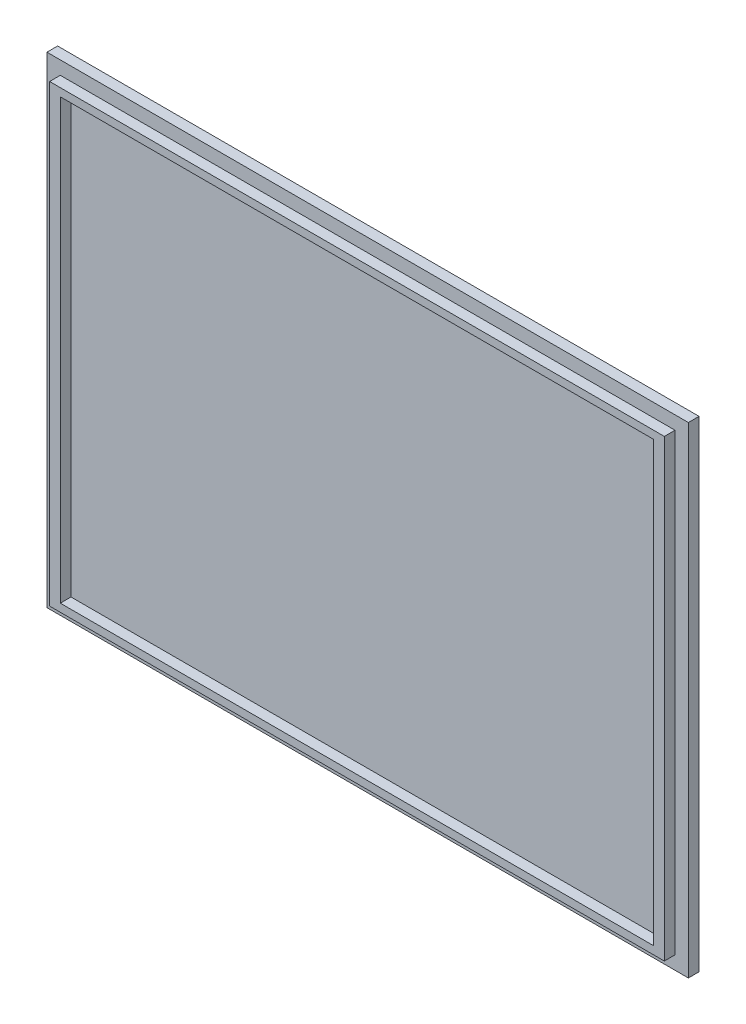
ISO-10303-21;
HEADER;
FILE_DESCRIPTION(('STEP AP214'),'2;1');
FILE_NAME('part.step','',(''),(''),'','','');
FILE_SCHEMA(('AUTOMOTIVE_DESIGN { 1 0 10303 214 1 1 1 1 }'));
ENDSEC;
DATA;
#1=APPLICATION_CONTEXT('core data for automotive mechanical design processes');
#2=APPLICATION_PROTOCOL_DEFINITION('international standard','automotive_design',2000,#1);
#3=PRODUCT_CONTEXT('',#1,'mechanical');
#4=PRODUCT('Part','Part','',(#3));
#5=PRODUCT_RELATED_PRODUCT_CATEGORY('part','',(#4));
#6=PRODUCT_DEFINITION_FORMATION('','',#4);
#7=PRODUCT_DEFINITION_CONTEXT('part definition',#1,'design');
#8=PRODUCT_DEFINITION('design','',#6,#7);
#9=PRODUCT_DEFINITION_SHAPE('','',#8);
#10=(LENGTH_UNIT() NAMED_UNIT(*) SI_UNIT(.MILLI.,.METRE.));
#11=(NAMED_UNIT(*) PLANE_ANGLE_UNIT() SI_UNIT($,.RADIAN.));
#12=(NAMED_UNIT(*) SI_UNIT($,.STERADIAN.) SOLID_ANGLE_UNIT());
#13=UNCERTAINTY_MEASURE_WITH_UNIT(LENGTH_MEASURE(1.E-05),#10,'distance_accuracy_value','');
#14=(GEOMETRIC_REPRESENTATION_CONTEXT(3) GLOBAL_UNCERTAINTY_ASSIGNED_CONTEXT((#13)) GLOBAL_UNIT_ASSIGNED_CONTEXT((#10,
#11,#12)) REPRESENTATION_CONTEXT('',''));
#15=CARTESIAN_POINT('',(0.,0.,0.));
#16=DIRECTION('',(0.,0.,1.));
#17=DIRECTION('',(1.,0.,0.));
#18=AXIS2_PLACEMENT_3D('',#15,#16,#17);
#19=CARTESIAN_POINT('',(0.,0.,2.));
#20=DIRECTION('',(0.,0.,1.));
#21=DIRECTION('',(1.,0.,0.));
#22=AXIS2_PLACEMENT_3D('',#19,#20,#21);
#23=PLANE('',#22);
#24=DIRECTION('',(0.,-1.,0.));
#25=VECTOR('',#24,1.);
#26=CARTESIAN_POINT('',(-60.,-45.,2.));
#27=LINE('',#26,#25);
#28=CARTESIAN_POINT('',(-60.,45.,2.));
#29=VERTEX_POINT('',#28);
#30=CARTESIAN_POINT('',(-60.,-45.,2.));
#31=VERTEX_POINT('',#30);
#32=EDGE_CURVE('E190',#29,#31,#27,.T.);
#33=ORIENTED_EDGE('',*,*,#32,.T.);
#34=DIRECTION('',(1.,0.,0.));
#35=VECTOR('',#34,1.);
#36=CARTESIAN_POINT('',(60.,-45.,2.));
#37=LINE('',#36,#35);
#38=CARTESIAN_POINT('',(60.,-45.,2.));
#39=VERTEX_POINT('',#38);
#40=EDGE_CURVE('E193',#31,#39,#37,.T.);
#41=ORIENTED_EDGE('',*,*,#40,.T.);
#42=DIRECTION('',(0.,1.,0.));
#43=VECTOR('',#42,1.);
#44=CARTESIAN_POINT('',(60.,-45.,2.));
#45=LINE('',#44,#43);
#46=CARTESIAN_POINT('',(60.,45.,2.));
#47=VERTEX_POINT('',#46);
#48=EDGE_CURVE('E196',#39,#47,#45,.T.);
#49=ORIENTED_EDGE('',*,*,#48,.T.);
#50=DIRECTION('',(-1.,0.,0.));
#51=VECTOR('',#50,1.);
#52=CARTESIAN_POINT('',(60.,45.,2.));
#53=LINE('',#52,#51);
#54=EDGE_CURVE('E198',#47,#29,#53,.T.);
#55=ORIENTED_EDGE('',*,*,#54,.T.);
#56=EDGE_LOOP('',(#33,#41,#49,#55));
#57=FACE_BOUND('',#56,.T.);
#58=DIRECTION('',(1.,0.,0.));
#59=VECTOR('',#58,1.);
#60=CARTESIAN_POINT('',(57.5,-42.5,2.));
#61=LINE('',#60,#59);
#62=CARTESIAN_POINT('',(-57.5,-42.5,2.));
#63=VERTEX_POINT('',#62);
#64=CARTESIAN_POINT('',(57.5,-42.5,2.));
#65=VERTEX_POINT('',#64);
#66=EDGE_CURVE('E176',#63,#65,#61,.T.);
#67=ORIENTED_EDGE('',*,*,#66,.F.);
#68=DIRECTION('',(0.,-1.,0.));
#69=VECTOR('',#68,1.);
#70=CARTESIAN_POINT('',(-57.5,-42.5,2.));
#71=LINE('',#70,#69);
#72=CARTESIAN_POINT('',(-57.5,42.5,2.));
#73=VERTEX_POINT('',#72);
#74=EDGE_CURVE('E141',#73,#63,#71,.T.);
#75=ORIENTED_EDGE('',*,*,#74,.F.);
#76=DIRECTION('',(-1.,0.,0.));
#77=VECTOR('',#76,1.);
#78=CARTESIAN_POINT('',(57.5,42.5,2.));
#79=LINE('',#78,#77);
#80=CARTESIAN_POINT('',(57.5,42.5,2.));
#81=VERTEX_POINT('',#80);
#82=EDGE_CURVE('E167',#81,#73,#79,.T.);
#83=ORIENTED_EDGE('',*,*,#82,.F.);
#84=DIRECTION('',(0.,1.,0.));
#85=VECTOR('',#84,1.);
#86=CARTESIAN_POINT('',(57.5,-42.5,2.));
#87=LINE('',#86,#85);
#88=EDGE_CURVE('E178',#65,#81,#87,.T.);
#89=ORIENTED_EDGE('',*,*,#88,.F.);
#90=EDGE_LOOP('',(#67,#75,#83,#89));
#91=FACE_BOUND('',#90,.T.);
#92=ADVANCED_FACE('F33',(#57,#91),#23,.T.);
#93=CARTESIAN_POINT('',(-60.,-45.,2.));
#94=DIRECTION('',(1.,0.,0.));
#95=DIRECTION('',(0.,0.,-1.));
#96=AXIS2_PLACEMENT_3D('',#93,#94,#95);
#97=PLANE('',#96);
#98=DIRECTION('',(0.,-1.,0.));
#99=VECTOR('',#98,1.);
#100=CARTESIAN_POINT('',(-60.,-45.,0.));
#101=LINE('',#100,#99);
#102=CARTESIAN_POINT('',(-60.,45.,0.));
#103=VERTEX_POINT('',#102);
#104=CARTESIAN_POINT('',(-60.,-45.,0.));
#105=VERTEX_POINT('',#104);
#106=EDGE_CURVE('E189',#103,#105,#101,.T.);
#107=ORIENTED_EDGE('',*,*,#106,.T.);
#108=DIRECTION('',(0.,0.,-1.));
#109=VECTOR('',#108,1.);
#110=CARTESIAN_POINT('',(-60.,-45.,2.));
#111=LINE('',#110,#109);
#112=EDGE_CURVE('E11',#31,#105,#111,.T.);
#113=ORIENTED_EDGE('',*,*,#112,.F.);
#114=ORIENTED_EDGE('',*,*,#32,.F.);
#115=DIRECTION('',(0.,0.,-1.));
#116=VECTOR('',#115,1.);
#117=CARTESIAN_POINT('',(-60.,45.,2.));
#118=LINE('',#117,#116);
#119=EDGE_CURVE('E200',#29,#103,#118,.T.);
#120=ORIENTED_EDGE('',*,*,#119,.T.);
#121=EDGE_LOOP('',(#107,#113,#114,#120));
#122=FACE_BOUND('',#121,.T.);
#123=ADVANCED_FACE('F35',(#122),#97,.F.);
#124=CARTESIAN_POINT('',(60.,-45.,2.));
#125=DIRECTION('',(0.,1.,0.));
#126=DIRECTION('',(-1.,0.,0.));
#127=AXIS2_PLACEMENT_3D('',#124,#125,#126);
#128=PLANE('',#127);
#129=DIRECTION('',(1.,0.,0.));
#130=VECTOR('',#129,1.);
#131=CARTESIAN_POINT('',(60.,-45.,0.));
#132=LINE('',#131,#130);
#133=CARTESIAN_POINT('',(60.,-45.,0.));
#134=VERTEX_POINT('',#133);
#135=EDGE_CURVE('E203',#105,#134,#132,.T.);
#136=ORIENTED_EDGE('',*,*,#135,.T.);
#137=DIRECTION('',(0.,0.,-1.));
#138=VECTOR('',#137,1.);
#139=CARTESIAN_POINT('',(60.,-45.,2.));
#140=LINE('',#139,#138);
#141=EDGE_CURVE('E41',#39,#134,#140,.T.);
#142=ORIENTED_EDGE('',*,*,#141,.F.);
#143=ORIENTED_EDGE('',*,*,#40,.F.);
#144=ORIENTED_EDGE('',*,*,#112,.T.);
#145=EDGE_LOOP('',(#136,#142,#143,#144));
#146=FACE_BOUND('',#145,.T.);
#147=ADVANCED_FACE('F233',(#146),#128,.F.);
#148=CARTESIAN_POINT('',(60.,-45.,2.));
#149=DIRECTION('',(-1.,0.,0.));
#150=DIRECTION('',(0.,0.,1.));
#151=AXIS2_PLACEMENT_3D('',#148,#149,#150);
#152=PLANE('',#151);
#153=DIRECTION('',(0.,1.,0.));
#154=VECTOR('',#153,1.);
#155=CARTESIAN_POINT('',(60.,-45.,0.));
#156=LINE('',#155,#154);
#157=CARTESIAN_POINT('',(60.,45.,0.));
#158=VERTEX_POINT('',#157);
#159=EDGE_CURVE('E205',#134,#158,#156,.T.);
#160=ORIENTED_EDGE('',*,*,#159,.T.);
#161=DIRECTION('',(0.,0.,-1.));
#162=VECTOR('',#161,1.);
#163=CARTESIAN_POINT('',(60.,45.,2.));
#164=LINE('',#163,#162);
#165=EDGE_CURVE('E210',#47,#158,#164,.T.);
#166=ORIENTED_EDGE('',*,*,#165,.F.);
#167=ORIENTED_EDGE('',*,*,#48,.F.);
#168=ORIENTED_EDGE('',*,*,#141,.T.);
#169=EDGE_LOOP('',(#160,#166,#167,#168));
#170=FACE_BOUND('',#169,.T.);
#171=ADVANCED_FACE('F217',(#170),#152,.F.);
#172=CARTESIAN_POINT('',(60.,45.,2.));
#173=DIRECTION('',(0.,-1.,0.));
#174=DIRECTION('',(1.,0.,0.));
#175=AXIS2_PLACEMENT_3D('',#172,#173,#174);
#176=PLANE('',#175);
#177=DIRECTION('',(-1.,0.,0.));
#178=VECTOR('',#177,1.);
#179=CARTESIAN_POINT('',(60.,45.,0.));
#180=LINE('',#179,#178);
#181=EDGE_CURVE('E194',#158,#103,#180,.T.);
#182=ORIENTED_EDGE('',*,*,#181,.T.);
#183=ORIENTED_EDGE('',*,*,#119,.F.);
#184=ORIENTED_EDGE('',*,*,#54,.F.);
#185=ORIENTED_EDGE('',*,*,#165,.T.);
#186=EDGE_LOOP('',(#182,#183,#184,#185));
#187=FACE_BOUND('',#186,.T.);
#188=ADVANCED_FACE('F226',(#187),#176,.F.);
#189=CARTESIAN_POINT('',(0.,0.,0.));
#190=DIRECTION('',(0.,0.,1.));
#191=DIRECTION('',(1.,0.,0.));
#192=AXIS2_PLACEMENT_3D('',#189,#190,#191);
#193=PLANE('',#192);
#194=ORIENTED_EDGE('',*,*,#106,.F.);
#195=ORIENTED_EDGE('',*,*,#181,.F.);
#196=ORIENTED_EDGE('',*,*,#159,.F.);
#197=ORIENTED_EDGE('',*,*,#135,.F.);
#198=EDGE_LOOP('',(#194,#195,#196,#197));
#199=FACE_BOUND('',#198,.T.);
#200=ADVANCED_FACE('F223',(#199),#193,.F.);
#201=CARTESIAN_POINT('',(0.,0.,4.));
#202=DIRECTION('',(0.,0.,1.));
#203=DIRECTION('',(1.,0.,0.));
#204=AXIS2_PLACEMENT_3D('',#201,#202,#203);
#205=PLANE('',#204);
#206=DIRECTION('',(0.,-1.,0.));
#207=VECTOR('',#206,1.);
#208=CARTESIAN_POINT('',(-57.5,-42.5,4.));
#209=LINE('',#208,#207);
#210=CARTESIAN_POINT('',(-57.5,42.5,4.));
#211=VERTEX_POINT('',#210);
#212=CARTESIAN_POINT('',(-57.5,-42.5,4.));
#213=VERTEX_POINT('',#212);
#214=EDGE_CURVE('E163',#211,#213,#209,.T.);
#215=ORIENTED_EDGE('',*,*,#214,.T.);
#216=DIRECTION('',(1.,0.,0.));
#217=VECTOR('',#216,1.);
#218=CARTESIAN_POINT('',(57.5,-42.5,4.));
#219=LINE('',#218,#217);
#220=CARTESIAN_POINT('',(57.5,-42.5,4.));
#221=VERTEX_POINT('',#220);
#222=EDGE_CURVE('E166',#213,#221,#219,.T.);
#223=ORIENTED_EDGE('',*,*,#222,.T.);
#224=DIRECTION('',(0.,1.,0.));
#225=VECTOR('',#224,1.);
#226=CARTESIAN_POINT('',(57.5,-42.5,4.));
#227=LINE('',#226,#225);
#228=CARTESIAN_POINT('',(57.5,42.5,4.));
#229=VERTEX_POINT('',#228);
#230=EDGE_CURVE('E169',#221,#229,#227,.T.);
#231=ORIENTED_EDGE('',*,*,#230,.T.);
#232=DIRECTION('',(-1.,0.,0.));
#233=VECTOR('',#232,1.);
#234=CARTESIAN_POINT('',(57.5,42.5,4.));
#235=LINE('',#234,#233);
#236=EDGE_CURVE('E171',#229,#211,#235,.T.);
#237=ORIENTED_EDGE('',*,*,#236,.T.);
#238=EDGE_LOOP('',(#215,#223,#231,#237));
#239=FACE_BOUND('',#238,.T.);
#240=DIRECTION('',(1.,0.,0.));
#241=VECTOR('',#240,1.);
#242=CARTESIAN_POINT('',(55.5,-41.0217391304348,4.));
#243=LINE('',#242,#241);
#244=CARTESIAN_POINT('',(-55.5,-41.0217391304348,4.));
#245=VERTEX_POINT('',#244);
#246=CARTESIAN_POINT('',(55.5,-41.0217391304348,4.));
#247=VERTEX_POINT('',#246);
#248=EDGE_CURVE('E133',#245,#247,#243,.T.);
#249=ORIENTED_EDGE('',*,*,#248,.F.);
#250=DIRECTION('',(0.,-1.,0.));
#251=VECTOR('',#250,1.);
#252=CARTESIAN_POINT('',(-55.5,-41.0217391304348,4.));
#253=LINE('',#252,#251);
#254=CARTESIAN_POINT('',(-55.5,41.0217391304348,4.));
#255=VERTEX_POINT('',#254);
#256=EDGE_CURVE('E124',#255,#245,#253,.T.);
#257=ORIENTED_EDGE('',*,*,#256,.F.);
#258=DIRECTION('',(-1.,0.,0.));
#259=VECTOR('',#258,1.);
#260=CARTESIAN_POINT('',(55.5,41.0217391304348,4.));
#261=LINE('',#260,#259);
#262=CARTESIAN_POINT('',(55.5,41.0217391304348,4.));
#263=VERTEX_POINT('',#262);
#264=EDGE_CURVE('E149',#263,#255,#261,.T.);
#265=ORIENTED_EDGE('',*,*,#264,.F.);
#266=DIRECTION('',(0.,1.,0.));
#267=VECTOR('',#266,1.);
#268=CARTESIAN_POINT('',(55.5,-41.0217391304348,4.));
#269=LINE('',#268,#267);
#270=EDGE_CURVE('E147',#247,#263,#269,.T.);
#271=ORIENTED_EDGE('',*,*,#270,.F.);
#272=EDGE_LOOP('',(#249,#257,#265,#271));
#273=FACE_BOUND('',#272,.T.);
#274=ADVANCED_FACE('F145',(#239,#273),#205,.T.);
#275=CARTESIAN_POINT('',(-57.5,-42.5,4.));
#276=DIRECTION('',(1.,0.,0.));
#277=DIRECTION('',(0.,0.,-1.));
#278=AXIS2_PLACEMENT_3D('',#275,#276,#277);
#279=PLANE('',#278);
#280=ORIENTED_EDGE('',*,*,#74,.T.);
#281=DIRECTION('',(0.,0.,-1.));
#282=VECTOR('',#281,1.);
#283=CARTESIAN_POINT('',(-57.5,-42.5,4.));
#284=LINE('',#283,#282);
#285=EDGE_CURVE('E187',#213,#63,#284,.T.);
#286=ORIENTED_EDGE('',*,*,#285,.F.);
#287=ORIENTED_EDGE('',*,*,#214,.F.);
#288=DIRECTION('',(0.,0.,-1.));
#289=VECTOR('',#288,1.);
#290=CARTESIAN_POINT('',(-57.5,42.5,4.));
#291=LINE('',#290,#289);
#292=EDGE_CURVE('E173',#211,#73,#291,.T.);
#293=ORIENTED_EDGE('',*,*,#292,.T.);
#294=EDGE_LOOP('',(#280,#286,#287,#293));
#295=FACE_BOUND('',#294,.T.);
#296=ADVANCED_FACE('F269',(#295),#279,.F.);
#297=CARTESIAN_POINT('',(57.5,-42.5,4.));
#298=DIRECTION('',(0.,1.,0.));
#299=DIRECTION('',(-1.,0.,0.));
#300=AXIS2_PLACEMENT_3D('',#297,#298,#299);
#301=PLANE('',#300);
#302=ORIENTED_EDGE('',*,*,#66,.T.);
#303=DIRECTION('',(0.,0.,-1.));
#304=VECTOR('',#303,1.);
#305=CARTESIAN_POINT('',(57.5,-42.5,4.));
#306=LINE('',#305,#304);
#307=EDGE_CURVE('E184',#221,#65,#306,.T.);
#308=ORIENTED_EDGE('',*,*,#307,.F.);
#309=ORIENTED_EDGE('',*,*,#222,.F.);
#310=ORIENTED_EDGE('',*,*,#285,.T.);
#311=EDGE_LOOP('',(#302,#308,#309,#310));
#312=FACE_BOUND('',#311,.T.);
#313=ADVANCED_FACE('F276',(#312),#301,.F.);
#314=CARTESIAN_POINT('',(57.5,-42.5,4.));
#315=DIRECTION('',(-1.,0.,0.));
#316=DIRECTION('',(0.,0.,1.));
#317=AXIS2_PLACEMENT_3D('',#314,#315,#316);
#318=PLANE('',#317);
#319=ORIENTED_EDGE('',*,*,#88,.T.);
#320=DIRECTION('',(0.,0.,-1.));
#321=VECTOR('',#320,1.);
#322=CARTESIAN_POINT('',(57.5,42.5,4.));
#323=LINE('',#322,#321);
#324=EDGE_CURVE('E48',#229,#81,#323,.T.);
#325=ORIENTED_EDGE('',*,*,#324,.F.);
#326=ORIENTED_EDGE('',*,*,#230,.F.);
#327=ORIENTED_EDGE('',*,*,#307,.T.);
#328=EDGE_LOOP('',(#319,#325,#326,#327));
#329=FACE_BOUND('',#328,.T.);
#330=ADVANCED_FACE('F273',(#329),#318,.F.);
#331=CARTESIAN_POINT('',(57.5,42.5,4.));
#332=DIRECTION('',(0.,-1.,0.));
#333=DIRECTION('',(1.,0.,0.));
#334=AXIS2_PLACEMENT_3D('',#331,#332,#333);
#335=PLANE('',#334);
#336=ORIENTED_EDGE('',*,*,#82,.T.);
#337=ORIENTED_EDGE('',*,*,#292,.F.);
#338=ORIENTED_EDGE('',*,*,#236,.F.);
#339=ORIENTED_EDGE('',*,*,#324,.T.);
#340=EDGE_LOOP('',(#336,#337,#338,#339));
#341=FACE_BOUND('',#340,.T.);
#342=ADVANCED_FACE('F266',(#341),#335,.F.);
#343=CARTESIAN_POINT('',(-55.5,-41.0217391304348,4.));
#344=DIRECTION('',(1.,0.,0.));
#345=DIRECTION('',(0.,0.,-1.));
#346=AXIS2_PLACEMENT_3D('',#343,#344,#345);
#347=PLANE('',#346);
#348=DIRECTION('',(0.,-1.,0.));
#349=VECTOR('',#348,1.);
#350=CARTESIAN_POINT('',(-55.5,-41.0217391304348,2.));
#351=LINE('',#350,#349);
#352=CARTESIAN_POINT('',(-55.5,41.0217391304348,2.));
#353=VERTEX_POINT('',#352);
#354=CARTESIAN_POINT('',(-55.5,-41.0217391304348,2.));
#355=VERTEX_POINT('',#354);
#356=EDGE_CURVE('E56',#353,#355,#351,.T.);
#357=ORIENTED_EDGE('',*,*,#356,.F.);
#358=DIRECTION('',(0.,0.,-1.));
#359=VECTOR('',#358,1.);
#360=CARTESIAN_POINT('',(-55.5,41.0217391304348,4.));
#361=LINE('',#360,#359);
#362=EDGE_CURVE('E129',#255,#353,#361,.T.);
#363=ORIENTED_EDGE('',*,*,#362,.F.);
#364=ORIENTED_EDGE('',*,*,#256,.T.);
#365=DIRECTION('',(0.,0.,-1.));
#366=VECTOR('',#365,1.);
#367=CARTESIAN_POINT('',(-55.5,-41.0217391304348,4.));
#368=LINE('',#367,#366);
#369=EDGE_CURVE('E127',#245,#355,#368,.T.);
#370=ORIENTED_EDGE('',*,*,#369,.T.);
#371=EDGE_LOOP('',(#357,#363,#364,#370));
#372=FACE_BOUND('',#371,.T.);
#373=ADVANCED_FACE('F126',(#372),#347,.T.);
#374=CARTESIAN_POINT('',(55.5,-41.0217391304348,4.));
#375=DIRECTION('',(0.,1.,0.));
#376=DIRECTION('',(0.,0.,1.));
#377=AXIS2_PLACEMENT_3D('',#374,#375,#376);
#378=PLANE('',#377);
#379=DIRECTION('',(1.,0.,0.));
#380=VECTOR('',#379,1.);
#381=CARTESIAN_POINT('',(55.5,-41.0217391304348,2.));
#382=LINE('',#381,#380);
#383=CARTESIAN_POINT('',(55.5,-41.0217391304348,2.));
#384=VERTEX_POINT('',#383);
#385=EDGE_CURVE('E140',#355,#384,#382,.T.);
#386=ORIENTED_EDGE('',*,*,#385,.F.);
#387=ORIENTED_EDGE('',*,*,#369,.F.);
#388=ORIENTED_EDGE('',*,*,#248,.T.);
#389=DIRECTION('',(0.,0.,-1.));
#390=VECTOR('',#389,1.);
#391=CARTESIAN_POINT('',(55.5,-41.0217391304348,4.));
#392=LINE('',#391,#390);
#393=EDGE_CURVE('E142',#247,#384,#392,.T.);
#394=ORIENTED_EDGE('',*,*,#393,.T.);
#395=EDGE_LOOP('',(#386,#387,#388,#394));
#396=FACE_BOUND('',#395,.T.);
#397=ADVANCED_FACE('F137',(#396),#378,.T.);
#398=CARTESIAN_POINT('',(55.5,-41.0217391304348,4.));
#399=DIRECTION('',(-1.,0.,0.));
#400=DIRECTION('',(0.,0.,1.));
#401=AXIS2_PLACEMENT_3D('',#398,#399,#400);
#402=PLANE('',#401);
#403=DIRECTION('',(0.,1.,0.));
#404=VECTOR('',#403,1.);
#405=CARTESIAN_POINT('',(55.5,-41.0217391304348,2.));
#406=LINE('',#405,#404);
#407=CARTESIAN_POINT('',(55.5,41.0217391304348,2.));
#408=VERTEX_POINT('',#407);
#409=EDGE_CURVE('E155',#384,#408,#406,.T.);
#410=ORIENTED_EDGE('',*,*,#409,.F.);
#411=ORIENTED_EDGE('',*,*,#393,.F.);
#412=ORIENTED_EDGE('',*,*,#270,.T.);
#413=DIRECTION('',(0.,0.,-1.));
#414=VECTOR('',#413,1.);
#415=CARTESIAN_POINT('',(55.5,41.0217391304348,4.));
#416=LINE('',#415,#414);
#417=EDGE_CURVE('E159',#263,#408,#416,.T.);
#418=ORIENTED_EDGE('',*,*,#417,.T.);
#419=EDGE_LOOP('',(#410,#411,#412,#418));
#420=FACE_BOUND('',#419,.T.);
#421=ADVANCED_FACE('F252',(#420),#402,.T.);
#422=CARTESIAN_POINT('',(55.5,41.0217391304348,4.));
#423=DIRECTION('',(0.,-1.,0.));
#424=DIRECTION('',(0.,0.,-1.));
#425=AXIS2_PLACEMENT_3D('',#422,#423,#424);
#426=PLANE('',#425);
#427=DIRECTION('',(-1.,0.,0.));
#428=VECTOR('',#427,1.);
#429=CARTESIAN_POINT('',(55.5,41.0217391304348,2.));
#430=LINE('',#429,#428);
#431=EDGE_CURVE('E134',#408,#353,#430,.T.);
#432=ORIENTED_EDGE('',*,*,#431,.F.);
#433=ORIENTED_EDGE('',*,*,#417,.F.);
#434=ORIENTED_EDGE('',*,*,#264,.T.);
#435=ORIENTED_EDGE('',*,*,#362,.T.);
#436=EDGE_LOOP('',(#432,#433,#434,#435));
#437=FACE_BOUND('',#436,.T.);
#438=ADVANCED_FACE('F248',(#437),#426,.T.);
#439=ORIENTED_EDGE('',*,*,#356,.T.);
#440=ORIENTED_EDGE('',*,*,#385,.T.);
#441=ORIENTED_EDGE('',*,*,#409,.T.);
#442=ORIENTED_EDGE('',*,*,#431,.T.);
#443=EDGE_LOOP('',(#439,#440,#441,#442));
#444=FACE_BOUND('',#443,.T.);
#445=ADVANCED_FACE('F242',(#444),#23,.T.);
#446=CLOSED_SHELL('',(#92,#123,#147,#171,#188,#200,#274,#296,#313,#330,#342,#373,#397,#421,#438,#445));
#447=MANIFOLD_SOLID_BREP('B2',#446);
#448=ADVANCED_BREP_SHAPE_REPRESENTATION('',(#18,#447),#14);
#449=SHAPE_DEFINITION_REPRESENTATION(#9,#448);
ENDSEC;
END-ISO-10303-21;
